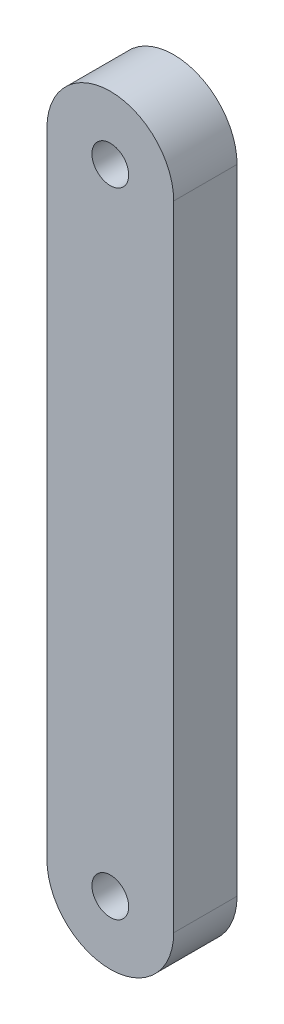
ISO-10303-21;
HEADER;
FILE_DESCRIPTION(('STEP AP214'),'2;1');
FILE_NAME('part.step','',(''),(''),'','','');
FILE_SCHEMA(('AUTOMOTIVE_DESIGN { 1 0 10303 214 1 1 1 1 }'));
ENDSEC;
DATA;
#1=APPLICATION_CONTEXT('core data for automotive mechanical design processes');
#2=APPLICATION_PROTOCOL_DEFINITION('international standard','automotive_design',2000,#1);
#3=PRODUCT_CONTEXT('',#1,'mechanical');
#4=PRODUCT('Part','Part','',(#3));
#5=PRODUCT_RELATED_PRODUCT_CATEGORY('part','',(#4));
#6=PRODUCT_DEFINITION_FORMATION('','',#4);
#7=PRODUCT_DEFINITION_CONTEXT('part definition',#1,'design');
#8=PRODUCT_DEFINITION('design','',#6,#7);
#9=PRODUCT_DEFINITION_SHAPE('','',#8);
#10=(LENGTH_UNIT() NAMED_UNIT(*) SI_UNIT(.MILLI.,.METRE.));
#11=(NAMED_UNIT(*) PLANE_ANGLE_UNIT() SI_UNIT($,.RADIAN.));
#12=(NAMED_UNIT(*) SI_UNIT($,.STERADIAN.) SOLID_ANGLE_UNIT());
#13=UNCERTAINTY_MEASURE_WITH_UNIT(LENGTH_MEASURE(1.E-05),#10,'distance_accuracy_value','');
#14=(GEOMETRIC_REPRESENTATION_CONTEXT(3) GLOBAL_UNCERTAINTY_ASSIGNED_CONTEXT((#13)) GLOBAL_UNIT_ASSIGNED_CONTEXT((#10,
#11,#12)) REPRESENTATION_CONTEXT('',''));
#15=CARTESIAN_POINT('',(0.,0.,0.));
#16=DIRECTION('',(0.,0.,1.));
#17=DIRECTION('',(1.,0.,0.));
#18=AXIS2_PLACEMENT_3D('',#15,#16,#17);
#19=CARTESIAN_POINT('',(0.,25.,5.));
#20=DIRECTION('',(0.,0.,-1.));
#21=DIRECTION('',(-1.,0.,0.));
#22=AXIS2_PLACEMENT_3D('',#19,#20,#21);
#23=CYLINDRICAL_SURFACE('',#22,5.);
#24=CARTESIAN_POINT('',(0.,25.,0.));
#25=DIRECTION('',(0.,0.,1.));
#26=DIRECTION('',(1.,0.,0.));
#27=AXIS2_PLACEMENT_3D('',#24,#25,#26);
#28=CIRCLE('',#27,5.);
#29=CARTESIAN_POINT('',(4.99999999999999,25.,0.));
#30=VERTEX_POINT('',#29);
#31=CARTESIAN_POINT('',(-5.00000000000001,25.,0.));
#32=VERTEX_POINT('',#31);
#33=EDGE_CURVE('E98',#30,#32,#28,.T.);
#34=ORIENTED_EDGE('',*,*,#33,.T.);
#35=DIRECTION('',(0.,0.,-1.));
#36=VECTOR('',#35,1.);
#37=CARTESIAN_POINT('',(-5.00000000000001,25.,5.));
#38=LINE('',#37,#36);
#39=CARTESIAN_POINT('',(-5.00000000000001,25.,5.));
#40=VERTEX_POINT('',#39);
#41=EDGE_CURVE('E11',#40,#32,#38,.T.);
#42=ORIENTED_EDGE('',*,*,#41,.F.);
#43=CARTESIAN_POINT('',(0.,25.,5.));
#44=DIRECTION('',(0.,0.,1.));
#45=DIRECTION('',(1.,0.,0.));
#46=AXIS2_PLACEMENT_3D('',#43,#44,#45);
#47=CIRCLE('',#46,5.);
#48=CARTESIAN_POINT('',(4.99999999999999,25.,5.));
#49=VERTEX_POINT('',#48);
#50=EDGE_CURVE('E86',#49,#40,#47,.T.);
#51=ORIENTED_EDGE('',*,*,#50,.F.);
#52=DIRECTION('',(0.,0.,-1.));
#53=VECTOR('',#52,1.);
#54=CARTESIAN_POINT('',(4.99999999999999,25.,5.));
#55=LINE('',#54,#53);
#56=EDGE_CURVE('E94',#49,#30,#55,.T.);
#57=ORIENTED_EDGE('',*,*,#56,.T.);
#58=EDGE_LOOP('',(#34,#42,#51,#57));
#59=FACE_BOUND('',#58,.T.);
#60=ADVANCED_FACE('F35',(#59),#23,.T.);
#61=CARTESIAN_POINT('',(-5.00000000000001,25.,5.));
#62=DIRECTION('',(1.,0.,0.));
#63=DIRECTION('',(0.,1.,0.));
#64=AXIS2_PLACEMENT_3D('',#61,#62,#63);
#65=PLANE('',#64);
#66=DIRECTION('',(0.,-1.,0.));
#67=VECTOR('',#66,1.);
#68=CARTESIAN_POINT('',(-5.00000000000001,25.,0.));
#69=LINE('',#68,#67);
#70=CARTESIAN_POINT('',(-4.99999999999999,-25.,0.));
#71=VERTEX_POINT('',#70);
#72=EDGE_CURVE('E90',#32,#71,#69,.T.);
#73=ORIENTED_EDGE('',*,*,#72,.T.);
#74=DIRECTION('',(0.,0.,-1.));
#75=VECTOR('',#74,1.);
#76=CARTESIAN_POINT('',(-4.99999999999999,-25.,5.));
#77=LINE('',#76,#75);
#78=CARTESIAN_POINT('',(-4.99999999999999,-25.,5.));
#79=VERTEX_POINT('',#78);
#80=EDGE_CURVE('E43',#79,#71,#77,.T.);
#81=ORIENTED_EDGE('',*,*,#80,.F.);
#82=DIRECTION('',(0.,-1.,0.));
#83=VECTOR('',#82,1.);
#84=CARTESIAN_POINT('',(-5.00000000000001,25.,5.));
#85=LINE('',#84,#83);
#86=EDGE_CURVE('E81',#40,#79,#85,.T.);
#87=ORIENTED_EDGE('',*,*,#86,.F.);
#88=ORIENTED_EDGE('',*,*,#41,.T.);
#89=EDGE_LOOP('',(#73,#81,#87,#88));
#90=FACE_BOUND('',#89,.T.);
#91=ADVANCED_FACE('F89',(#90),#65,.F.);
#92=CARTESIAN_POINT('',(0.,-25.,5.));
#93=DIRECTION('',(0.,0.,-1.));
#94=DIRECTION('',(-1.,0.,0.));
#95=AXIS2_PLACEMENT_3D('',#92,#93,#94);
#96=CYLINDRICAL_SURFACE('',#95,5.);
#97=CARTESIAN_POINT('',(0.,-25.,0.));
#98=DIRECTION('',(0.,0.,1.));
#99=DIRECTION('',(1.,0.,0.));
#100=AXIS2_PLACEMENT_3D('',#97,#98,#99);
#101=CIRCLE('',#100,5.);
#102=CARTESIAN_POINT('',(5.,-25.,0.));
#103=VERTEX_POINT('',#102);
#104=EDGE_CURVE('E68',#71,#103,#101,.T.);
#105=ORIENTED_EDGE('',*,*,#104,.T.);
#106=DIRECTION('',(0.,0.,-1.));
#107=VECTOR('',#106,1.);
#108=CARTESIAN_POINT('',(5.,-25.,5.));
#109=LINE('',#108,#107);
#110=CARTESIAN_POINT('',(5.,-25.,5.));
#111=VERTEX_POINT('',#110);
#112=EDGE_CURVE('E91',#111,#103,#109,.T.);
#113=ORIENTED_EDGE('',*,*,#112,.F.);
#114=CARTESIAN_POINT('',(0.,-25.,5.));
#115=DIRECTION('',(0.,0.,1.));
#116=DIRECTION('',(1.,0.,0.));
#117=AXIS2_PLACEMENT_3D('',#114,#115,#116);
#118=CIRCLE('',#117,5.);
#119=EDGE_CURVE('E84',#79,#111,#118,.T.);
#120=ORIENTED_EDGE('',*,*,#119,.F.);
#121=ORIENTED_EDGE('',*,*,#80,.T.);
#122=EDGE_LOOP('',(#105,#113,#120,#121));
#123=FACE_BOUND('',#122,.T.);
#124=ADVANCED_FACE('F92',(#123),#96,.T.);
#125=CARTESIAN_POINT('',(4.99999999999999,25.,5.));
#126=DIRECTION('',(-1.,0.,0.));
#127=DIRECTION('',(0.,-1.,0.));
#128=AXIS2_PLACEMENT_3D('',#125,#126,#127);
#129=PLANE('',#128);
#130=DIRECTION('',(0.,1.,0.));
#131=VECTOR('',#130,1.);
#132=CARTESIAN_POINT('',(4.99999999999999,25.,0.));
#133=LINE('',#132,#131);
#134=EDGE_CURVE('E74',#103,#30,#133,.T.);
#135=ORIENTED_EDGE('',*,*,#134,.T.);
#136=ORIENTED_EDGE('',*,*,#56,.F.);
#137=DIRECTION('',(0.,1.,0.));
#138=VECTOR('',#137,1.);
#139=CARTESIAN_POINT('',(4.99999999999999,25.,5.));
#140=LINE('',#139,#138);
#141=EDGE_CURVE('E51',#111,#49,#140,.T.);
#142=ORIENTED_EDGE('',*,*,#141,.F.);
#143=ORIENTED_EDGE('',*,*,#112,.T.);
#144=EDGE_LOOP('',(#135,#136,#142,#143));
#145=FACE_BOUND('',#144,.T.);
#146=ADVANCED_FACE('F106',(#145),#129,.F.);
#147=CARTESIAN_POINT('',(0.,25.,5.));
#148=DIRECTION('',(0.,0.,1.));
#149=DIRECTION('',(1.,0.,0.));
#150=AXIS2_PLACEMENT_3D('',#147,#148,#149);
#151=PLANE('',#150);
#152=CARTESIAN_POINT('',(0.,25.,5.));
#153=DIRECTION('',(0.,0.,1.));
#154=DIRECTION('',(1.,0.,0.));
#155=AXIS2_PLACEMENT_3D('',#152,#153,#154);
#156=CIRCLE('',#155,1.45);
#157=CARTESIAN_POINT('',(1.44999999999999,25.,5.));
#158=VERTEX_POINT('',#157);
#159=EDGE_CURVE('E120',#158,#158,#156,.T.);
#160=ORIENTED_EDGE('',*,*,#159,.F.);
#161=EDGE_LOOP('',(#160));
#162=FACE_BOUND('',#161,.T.);
#163=CARTESIAN_POINT('',(0.,-25.,5.));
#164=DIRECTION('',(0.,0.,1.));
#165=DIRECTION('',(1.,0.,0.));
#166=AXIS2_PLACEMENT_3D('',#163,#164,#165);
#167=CIRCLE('',#166,1.45);
#168=CARTESIAN_POINT('',(1.45,-25.,5.));
#169=VERTEX_POINT('',#168);
#170=EDGE_CURVE('E114',#169,#169,#167,.T.);
#171=ORIENTED_EDGE('',*,*,#170,.F.);
#172=EDGE_LOOP('',(#171));
#173=FACE_BOUND('',#172,.T.);
#174=ORIENTED_EDGE('',*,*,#50,.T.);
#175=ORIENTED_EDGE('',*,*,#86,.T.);
#176=ORIENTED_EDGE('',*,*,#119,.T.);
#177=ORIENTED_EDGE('',*,*,#141,.T.);
#178=EDGE_LOOP('',(#174,#175,#176,#177));
#179=FACE_BOUND('',#178,.T.);
#180=ADVANCED_FACE('F82',(#162,#173,#179),#151,.T.);
#181=CARTESIAN_POINT('',(0.,25.,0.));
#182=DIRECTION('',(0.,0.,1.));
#183=DIRECTION('',(1.,0.,0.));
#184=AXIS2_PLACEMENT_3D('',#181,#182,#183);
#185=PLANE('',#184);
#186=CARTESIAN_POINT('',(0.,25.,0.));
#187=DIRECTION('',(0.,0.,1.));
#188=DIRECTION('',(1.,0.,0.));
#189=AXIS2_PLACEMENT_3D('',#186,#187,#188);
#190=CIRCLE('',#189,1.45);
#191=CARTESIAN_POINT('',(1.44999999999999,25.,0.));
#192=VERTEX_POINT('',#191);
#193=EDGE_CURVE('E117',#192,#192,#190,.T.);
#194=ORIENTED_EDGE('',*,*,#193,.T.);
#195=EDGE_LOOP('',(#194));
#196=FACE_BOUND('',#195,.T.);
#197=CARTESIAN_POINT('',(0.,-25.,0.));
#198=DIRECTION('',(0.,0.,1.));
#199=DIRECTION('',(1.,0.,0.));
#200=AXIS2_PLACEMENT_3D('',#197,#198,#199);
#201=CIRCLE('',#200,1.45);
#202=CARTESIAN_POINT('',(1.45,-25.,0.));
#203=VERTEX_POINT('',#202);
#204=EDGE_CURVE('E101',#203,#203,#201,.T.);
#205=ORIENTED_EDGE('',*,*,#204,.T.);
#206=EDGE_LOOP('',(#205));
#207=FACE_BOUND('',#206,.T.);
#208=ORIENTED_EDGE('',*,*,#33,.F.);
#209=ORIENTED_EDGE('',*,*,#134,.F.);
#210=ORIENTED_EDGE('',*,*,#104,.F.);
#211=ORIENTED_EDGE('',*,*,#72,.F.);
#212=EDGE_LOOP('',(#208,#209,#210,#211));
#213=FACE_BOUND('',#212,.T.);
#214=ADVANCED_FACE('F109',(#196,#207,#213),#185,.F.);
#215=CARTESIAN_POINT('',(0.,-25.,5.));
#216=DIRECTION('',(0.,0.,1.));
#217=DIRECTION('',(1.,0.,0.));
#218=AXIS2_PLACEMENT_3D('',#215,#216,#217);
#219=CYLINDRICAL_SURFACE('',#218,1.45);
#220=ORIENTED_EDGE('',*,*,#204,.F.);
#221=EDGE_LOOP('',(#220));
#222=FACE_BOUND('',#221,.T.);
#223=ORIENTED_EDGE('',*,*,#170,.T.);
#224=EDGE_LOOP('',(#223));
#225=FACE_BOUND('',#224,.T.);
#226=ADVANCED_FACE('F131',(#222,#225),#219,.F.);
#227=CARTESIAN_POINT('',(0.,25.,5.));
#228=DIRECTION('',(0.,0.,1.));
#229=DIRECTION('',(1.,0.,0.));
#230=AXIS2_PLACEMENT_3D('',#227,#228,#229);
#231=CYLINDRICAL_SURFACE('',#230,1.45);
#232=ORIENTED_EDGE('',*,*,#193,.F.);
#233=EDGE_LOOP('',(#232));
#234=FACE_BOUND('',#233,.T.);
#235=ORIENTED_EDGE('',*,*,#159,.T.);
#236=EDGE_LOOP('',(#235));
#237=FACE_BOUND('',#236,.T.);
#238=ADVANCED_FACE('F124',(#234,#237),#231,.F.);
#239=CLOSED_SHELL('',(#60,#91,#124,#146,#180,#214,#226,#238));
#240=MANIFOLD_SOLID_BREP('B2',#239);
#241=ADVANCED_BREP_SHAPE_REPRESENTATION('',(#18,#240),#14);
#242=SHAPE_DEFINITION_REPRESENTATION(#9,#241);
ENDSEC;
END-ISO-10303-21;
